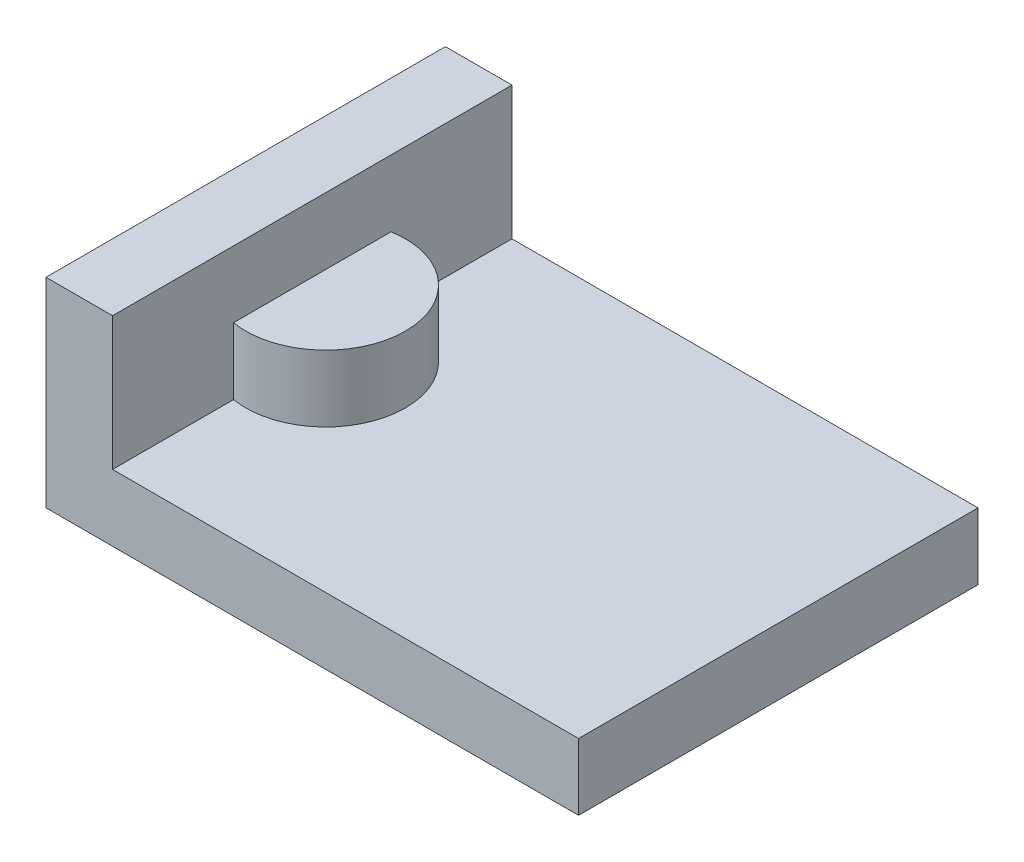
ISO-10303-21;
HEADER;
FILE_DESCRIPTION(('STEP AP214'),'2;1');
FILE_NAME('part.step','',(''),(''),'','','');
FILE_SCHEMA(('AUTOMOTIVE_DESIGN { 1 0 10303 214 1 1 1 1 }'));
ENDSEC;
DATA;
#1=APPLICATION_CONTEXT('core data for automotive mechanical design processes');
#2=APPLICATION_PROTOCOL_DEFINITION('international standard','automotive_design',2000,#1);
#3=PRODUCT_CONTEXT('',#1,'mechanical');
#4=PRODUCT('Part','Part','',(#3));
#5=PRODUCT_RELATED_PRODUCT_CATEGORY('part','',(#4));
#6=PRODUCT_DEFINITION_FORMATION('','',#4);
#7=PRODUCT_DEFINITION_CONTEXT('part definition',#1,'design');
#8=PRODUCT_DEFINITION('design','',#6,#7);
#9=PRODUCT_DEFINITION_SHAPE('','',#8);
#10=(LENGTH_UNIT() NAMED_UNIT(*) SI_UNIT(.MILLI.,.METRE.));
#11=(NAMED_UNIT(*) PLANE_ANGLE_UNIT() SI_UNIT($,.RADIAN.));
#12=(NAMED_UNIT(*) SI_UNIT($,.STERADIAN.) SOLID_ANGLE_UNIT());
#13=UNCERTAINTY_MEASURE_WITH_UNIT(LENGTH_MEASURE(1.E-05),#10,'distance_accuracy_value','');
#14=(GEOMETRIC_REPRESENTATION_CONTEXT(3) GLOBAL_UNCERTAINTY_ASSIGNED_CONTEXT((#13)) GLOBAL_UNIT_ASSIGNED_CONTEXT((#10,
#11,#12)) REPRESENTATION_CONTEXT('',''));
#15=CARTESIAN_POINT('',(0.,0.,0.));
#16=DIRECTION('',(0.,0.,1.));
#17=DIRECTION('',(1.,0.,0.));
#18=AXIS2_PLACEMENT_3D('',#15,#16,#17);
#19=CARTESIAN_POINT('',(-30.,30.,30.));
#20=DIRECTION('',(-1.,0.,0.));
#21=DIRECTION('',(0.,0.,1.));
#22=AXIS2_PLACEMENT_3D('',#19,#20,#21);
#23=PLANE('',#22);
#24=DIRECTION('',(0.,-1.,0.));
#25=VECTOR('',#24,1.);
#26=CARTESIAN_POINT('',(-30.,20.,-11.8321595661992));
#27=LINE('',#26,#25);
#28=CARTESIAN_POINT('',(-30.,10.,-11.8321595661992));
#29=VERTEX_POINT('',#28);
#30=CARTESIAN_POINT('',(-30.,20.,-11.8321595661992));
#31=VERTEX_POINT('',#30);
#32=EDGE_CURVE('E11',#29,#31,#27,.F.);
#33=ORIENTED_EDGE('',*,*,#32,.F.);
#34=DIRECTION('',(0.,0.,-1.));
#35=VECTOR('',#34,1.);
#36=CARTESIAN_POINT('',(-30.,10.,0.));
#37=LINE('',#36,#35);
#38=CARTESIAN_POINT('',(-30.,10.,-30.));
#39=VERTEX_POINT('',#38);
#40=EDGE_CURVE('E116',#29,#39,#37,.T.);
#41=ORIENTED_EDGE('',*,*,#40,.T.);
#42=DIRECTION('',(0.,-1.,0.));
#43=VECTOR('',#42,1.);
#44=CARTESIAN_POINT('',(-30.,30.,-30.));
#45=LINE('',#44,#43);
#46=CARTESIAN_POINT('',(-30.,30.,-30.));
#47=VERTEX_POINT('',#46);
#48=EDGE_CURVE('E149',#47,#39,#45,.T.);
#49=ORIENTED_EDGE('',*,*,#48,.F.);
#50=DIRECTION('',(0.,0.,-1.));
#51=VECTOR('',#50,1.);
#52=CARTESIAN_POINT('',(-30.,30.,30.));
#53=LINE('',#52,#51);
#54=CARTESIAN_POINT('',(-30.,30.,30.));
#55=VERTEX_POINT('',#54);
#56=EDGE_CURVE('E154',#55,#47,#53,.T.);
#57=ORIENTED_EDGE('',*,*,#56,.F.);
#58=DIRECTION('',(0.,-1.,0.));
#59=VECTOR('',#58,1.);
#60=CARTESIAN_POINT('',(-30.,30.,30.));
#61=LINE('',#60,#59);
#62=CARTESIAN_POINT('',(-30.,10.,30.));
#63=VERTEX_POINT('',#62);
#64=EDGE_CURVE('E142',#55,#63,#61,.T.);
#65=ORIENTED_EDGE('',*,*,#64,.T.);
#66=CARTESIAN_POINT('',(-30.,10.,11.8321595661992));
#67=VERTEX_POINT('',#66);
#68=EDGE_CURVE('E61',#63,#67,#37,.T.);
#69=ORIENTED_EDGE('',*,*,#68,.T.);
#70=DIRECTION('',(0.,-1.,0.));
#71=VECTOR('',#70,1.);
#72=CARTESIAN_POINT('',(-30.,20.,11.8321595661992));
#73=LINE('',#72,#71);
#74=CARTESIAN_POINT('',(-30.,20.,11.8321595661992));
#75=VERTEX_POINT('',#74);
#76=EDGE_CURVE('E51',#75,#67,#73,.T.);
#77=ORIENTED_EDGE('',*,*,#76,.F.);
#78=DIRECTION('',(0.,0.,-1.));
#79=VECTOR('',#78,1.);
#80=CARTESIAN_POINT('',(-30.,20.,30.));
#81=LINE('',#80,#79);
#82=EDGE_CURVE('E106',#75,#31,#81,.T.);
#83=ORIENTED_EDGE('',*,*,#82,.T.);
#84=EDGE_LOOP('',(#33,#41,#49,#57,#65,#69,#77,#83));
#85=FACE_BOUND('',#84,.T.);
#86=ADVANCED_FACE('F43',(#85),#23,.F.);
#87=CARTESIAN_POINT('',(0.,10.,0.));
#88=DIRECTION('',(0.,-1.,0.));
#89=DIRECTION('',(0.,0.,-1.));
#90=AXIS2_PLACEMENT_3D('',#87,#88,#89);
#91=PLANE('',#90);
#92=CARTESIAN_POINT('',(-28.,10.,0.));
#93=DIRECTION('',(0.,-1.,0.));
#94=DIRECTION('',(0.,0.,-1.));
#95=AXIS2_PLACEMENT_3D('',#92,#93,#94);
#96=CIRCLE('',#95,12.);
#97=EDGE_CURVE('E111',#67,#29,#96,.F.);
#98=ORIENTED_EDGE('',*,*,#97,.F.);
#99=ORIENTED_EDGE('',*,*,#68,.F.);
#100=DIRECTION('',(1.,0.,0.));
#101=VECTOR('',#100,1.);
#102=CARTESIAN_POINT('',(-40.,10.,30.));
#103=LINE('',#102,#101);
#104=CARTESIAN_POINT('',(40.,10.,30.));
#105=VERTEX_POINT('',#104);
#106=EDGE_CURVE('E133',#63,#105,#103,.T.);
#107=ORIENTED_EDGE('',*,*,#106,.T.);
#108=DIRECTION('',(0.,0.,-1.));
#109=VECTOR('',#108,1.);
#110=CARTESIAN_POINT('',(40.,10.,30.));
#111=LINE('',#110,#109);
#112=CARTESIAN_POINT('',(40.,10.,-30.));
#113=VERTEX_POINT('',#112);
#114=EDGE_CURVE('E144',#105,#113,#111,.T.);
#115=ORIENTED_EDGE('',*,*,#114,.T.);
#116=DIRECTION('',(-1.,0.,0.));
#117=VECTOR('',#116,1.);
#118=CARTESIAN_POINT('',(-40.,10.,-30.));
#119=LINE('',#118,#117);
#120=EDGE_CURVE('E135',#113,#39,#119,.T.);
#121=ORIENTED_EDGE('',*,*,#120,.T.);
#122=ORIENTED_EDGE('',*,*,#40,.F.);
#123=EDGE_LOOP('',(#98,#99,#107,#115,#121,#122));
#124=FACE_BOUND('',#123,.T.);
#125=ADVANCED_FACE('F163',(#124),#91,.F.);
#126=CARTESIAN_POINT('',(-40.,10.,30.));
#127=DIRECTION('',(1.,0.,0.));
#128=DIRECTION('',(0.,0.,-1.));
#129=AXIS2_PLACEMENT_3D('',#126,#127,#128);
#130=PLANE('',#129);
#131=DIRECTION('',(0.,0.,1.));
#132=VECTOR('',#131,1.);
#133=CARTESIAN_POINT('',(-40.,0.,30.));
#134=LINE('',#133,#132);
#135=CARTESIAN_POINT('',(-40.,0.,-30.));
#136=VERTEX_POINT('',#135);
#137=CARTESIAN_POINT('',(-40.,0.,30.));
#138=VERTEX_POINT('',#137);
#139=EDGE_CURVE('E138',#136,#138,#134,.T.);
#140=ORIENTED_EDGE('',*,*,#139,.T.);
#141=DIRECTION('',(0.,-1.,0.));
#142=VECTOR('',#141,1.);
#143=CARTESIAN_POINT('',(-40.,10.,30.));
#144=LINE('',#143,#142);
#145=CARTESIAN_POINT('',(-40.,30.,30.));
#146=VERTEX_POINT('',#145);
#147=EDGE_CURVE('E118',#146,#138,#144,.T.);
#148=ORIENTED_EDGE('',*,*,#147,.F.);
#149=DIRECTION('',(0.,0.,1.));
#150=VECTOR('',#149,1.);
#151=CARTESIAN_POINT('',(-40.,30.,30.));
#152=LINE('',#151,#150);
#153=CARTESIAN_POINT('',(-40.,30.,-30.));
#154=VERTEX_POINT('',#153);
#155=EDGE_CURVE('E157',#154,#146,#152,.T.);
#156=ORIENTED_EDGE('',*,*,#155,.F.);
#157=DIRECTION('',(0.,-1.,0.));
#158=VECTOR('',#157,1.);
#159=CARTESIAN_POINT('',(-40.,10.,-30.));
#160=LINE('',#159,#158);
#161=EDGE_CURVE('E129',#154,#136,#160,.T.);
#162=ORIENTED_EDGE('',*,*,#161,.T.);
#163=EDGE_LOOP('',(#140,#148,#156,#162));
#164=FACE_BOUND('',#163,.T.);
#165=ADVANCED_FACE('F44',(#164),#130,.F.);
#166=CARTESIAN_POINT('',(-40.,10.,30.));
#167=DIRECTION('',(0.,0.,-1.));
#168=DIRECTION('',(-1.,0.,0.));
#169=AXIS2_PLACEMENT_3D('',#166,#167,#168);
#170=PLANE('',#169);
#171=ORIENTED_EDGE('',*,*,#106,.F.);
#172=ORIENTED_EDGE('',*,*,#64,.F.);
#173=DIRECTION('',(1.,0.,0.));
#174=VECTOR('',#173,1.);
#175=CARTESIAN_POINT('',(-40.,30.,30.));
#176=LINE('',#175,#174);
#177=EDGE_CURVE('E160',#146,#55,#176,.T.);
#178=ORIENTED_EDGE('',*,*,#177,.F.);
#179=ORIENTED_EDGE('',*,*,#147,.T.);
#180=DIRECTION('',(1.,0.,0.));
#181=VECTOR('',#180,1.);
#182=CARTESIAN_POINT('',(-40.,0.,30.));
#183=LINE('',#182,#181);
#184=CARTESIAN_POINT('',(40.,0.,30.));
#185=VERTEX_POINT('',#184);
#186=EDGE_CURVE('E139',#138,#185,#183,.T.);
#187=ORIENTED_EDGE('',*,*,#186,.T.);
#188=DIRECTION('',(0.,-1.,0.));
#189=VECTOR('',#188,1.);
#190=CARTESIAN_POINT('',(40.,10.,30.));
#191=LINE('',#190,#189);
#192=EDGE_CURVE('E124',#105,#185,#191,.T.);
#193=ORIENTED_EDGE('',*,*,#192,.F.);
#194=EDGE_LOOP('',(#171,#172,#178,#179,#187,#193));
#195=FACE_BOUND('',#194,.T.);
#196=ADVANCED_FACE('F179',(#195),#170,.F.);
#197=CARTESIAN_POINT('',(40.,10.,30.));
#198=DIRECTION('',(-1.,0.,0.));
#199=DIRECTION('',(0.,0.,1.));
#200=AXIS2_PLACEMENT_3D('',#197,#198,#199);
#201=PLANE('',#200);
#202=DIRECTION('',(0.,0.,-1.));
#203=VECTOR('',#202,1.);
#204=CARTESIAN_POINT('',(40.,0.,30.));
#205=LINE('',#204,#203);
#206=CARTESIAN_POINT('',(40.,0.,-30.));
#207=VERTEX_POINT('',#206);
#208=EDGE_CURVE('E137',#185,#207,#205,.T.);
#209=ORIENTED_EDGE('',*,*,#208,.T.);
#210=DIRECTION('',(0.,-1.,0.));
#211=VECTOR('',#210,1.);
#212=CARTESIAN_POINT('',(40.,10.,-30.));
#213=LINE('',#212,#211);
#214=EDGE_CURVE('E127',#113,#207,#213,.T.);
#215=ORIENTED_EDGE('',*,*,#214,.F.);
#216=ORIENTED_EDGE('',*,*,#114,.F.);
#217=ORIENTED_EDGE('',*,*,#192,.T.);
#218=EDGE_LOOP('',(#209,#215,#216,#217));
#219=FACE_BOUND('',#218,.T.);
#220=ADVANCED_FACE('F181',(#219),#201,.F.);
#221=CARTESIAN_POINT('',(-40.,10.,-30.));
#222=DIRECTION('',(0.,0.,1.));
#223=DIRECTION('',(1.,0.,0.));
#224=AXIS2_PLACEMENT_3D('',#221,#222,#223);
#225=PLANE('',#224);
#226=ORIENTED_EDGE('',*,*,#161,.F.);
#227=DIRECTION('',(-1.,0.,0.));
#228=VECTOR('',#227,1.);
#229=CARTESIAN_POINT('',(-40.,30.,-30.));
#230=LINE('',#229,#228);
#231=EDGE_CURVE('E155',#47,#154,#230,.T.);
#232=ORIENTED_EDGE('',*,*,#231,.F.);
#233=ORIENTED_EDGE('',*,*,#48,.T.);
#234=ORIENTED_EDGE('',*,*,#120,.F.);
#235=ORIENTED_EDGE('',*,*,#214,.T.);
#236=DIRECTION('',(-1.,0.,0.));
#237=VECTOR('',#236,1.);
#238=CARTESIAN_POINT('',(-40.,0.,-30.));
#239=LINE('',#238,#237);
#240=EDGE_CURVE('E134',#207,#136,#239,.T.);
#241=ORIENTED_EDGE('',*,*,#240,.T.);
#242=EDGE_LOOP('',(#226,#232,#233,#234,#235,#241));
#243=FACE_BOUND('',#242,.T.);
#244=ADVANCED_FACE('F168',(#243),#225,.F.);
#245=CARTESIAN_POINT('',(0.,0.,0.));
#246=DIRECTION('',(0.,-1.,0.));
#247=DIRECTION('',(0.,0.,-1.));
#248=AXIS2_PLACEMENT_3D('',#245,#246,#247);
#249=PLANE('',#248);
#250=ORIENTED_EDGE('',*,*,#186,.F.);
#251=ORIENTED_EDGE('',*,*,#139,.F.);
#252=ORIENTED_EDGE('',*,*,#240,.F.);
#253=ORIENTED_EDGE('',*,*,#208,.F.);
#254=EDGE_LOOP('',(#250,#251,#252,#253));
#255=FACE_BOUND('',#254,.T.);
#256=ADVANCED_FACE('F190',(#255),#249,.T.);
#257=CARTESIAN_POINT('',(0.,30.,0.));
#258=DIRECTION('',(0.,-1.,0.));
#259=DIRECTION('',(0.,0.,-1.));
#260=AXIS2_PLACEMENT_3D('',#257,#258,#259);
#261=PLANE('',#260);
#262=ORIENTED_EDGE('',*,*,#155,.T.);
#263=ORIENTED_EDGE('',*,*,#177,.T.);
#264=ORIENTED_EDGE('',*,*,#56,.T.);
#265=ORIENTED_EDGE('',*,*,#231,.T.);
#266=EDGE_LOOP('',(#262,#263,#264,#265));
#267=FACE_BOUND('',#266,.T.);
#268=ADVANCED_FACE('F171',(#267),#261,.F.);
#269=CARTESIAN_POINT('',(-28.,20.,0.));
#270=DIRECTION('',(0.,-1.,0.));
#271=DIRECTION('',(0.,0.,-1.));
#272=AXIS2_PLACEMENT_3D('',#269,#270,#271);
#273=CYLINDRICAL_SURFACE('',#272,12.);
#274=ORIENTED_EDGE('',*,*,#97,.T.);
#275=ORIENTED_EDGE('',*,*,#32,.T.);
#276=CARTESIAN_POINT('',(-28.,20.,0.));
#277=DIRECTION('',(0.,1.,0.));
#278=DIRECTION('',(0.,0.,1.));
#279=AXIS2_PLACEMENT_3D('',#276,#277,#278);
#280=CIRCLE('',#279,12.);
#281=EDGE_CURVE('E60',#75,#31,#280,.T.);
#282=ORIENTED_EDGE('',*,*,#281,.F.);
#283=ORIENTED_EDGE('',*,*,#76,.T.);
#284=EDGE_LOOP('',(#274,#275,#282,#283));
#285=FACE_BOUND('',#284,.T.);
#286=ADVANCED_FACE('F114',(#285),#273,.T.);
#287=CARTESIAN_POINT('',(-28.,20.,0.));
#288=DIRECTION('',(0.,1.,0.));
#289=DIRECTION('',(0.,0.,1.));
#290=AXIS2_PLACEMENT_3D('',#287,#288,#289);
#291=PLANE('',#290);
#292=ORIENTED_EDGE('',*,*,#82,.F.);
#293=ORIENTED_EDGE('',*,*,#281,.T.);
#294=EDGE_LOOP('',(#292,#293));
#295=FACE_BOUND('',#294,.T.);
#296=ADVANCED_FACE('F110',(#295),#291,.T.);
#297=CLOSED_SHELL('',(#86,#125,#165,#196,#220,#244,#256,#268,#286,#296));
#298=MANIFOLD_SOLID_BREP('B2',#297);
#299=ADVANCED_BREP_SHAPE_REPRESENTATION('',(#18,#298),#14);
#300=SHAPE_DEFINITION_REPRESENTATION(#9,#299);
ENDSEC;
END-ISO-10303-21;
